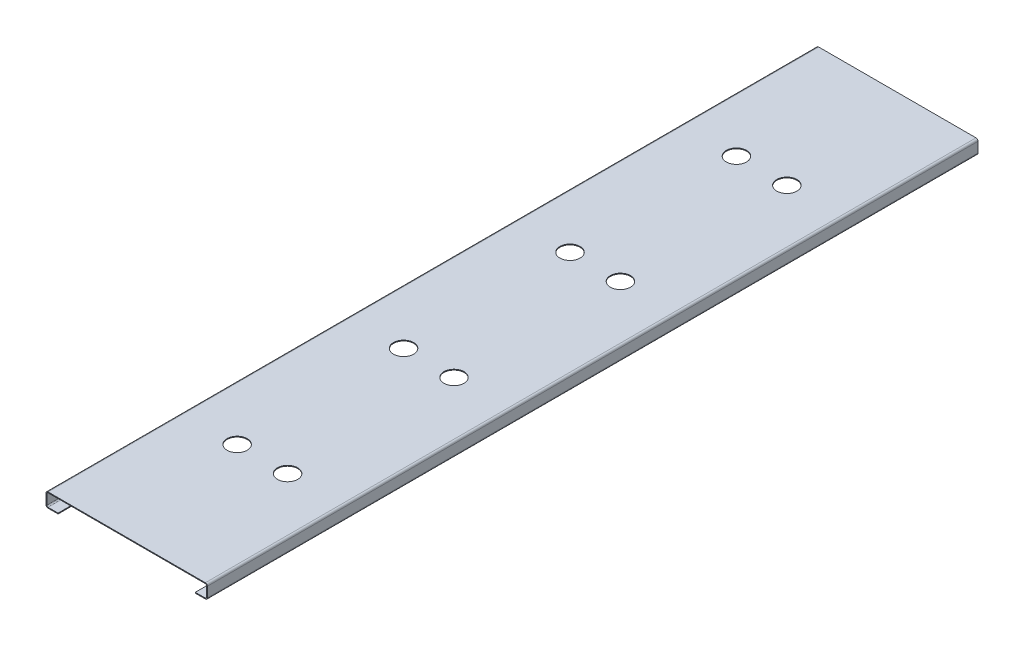
ISO-10303-21;
HEADER;
FILE_DESCRIPTION(('STEP AP214'),'2;1');
FILE_NAME('part.step','',(''),(''),'','','');
FILE_SCHEMA(('AUTOMOTIVE_DESIGN { 1 0 10303 214 1 1 1 1 }'));
ENDSEC;
DATA;
#1=APPLICATION_CONTEXT('core data for automotive mechanical design processes');
#2=APPLICATION_PROTOCOL_DEFINITION('international standard','automotive_design',2000,#1);
#3=PRODUCT_CONTEXT('',#1,'mechanical');
#4=PRODUCT('Part','Part','',(#3));
#5=PRODUCT_RELATED_PRODUCT_CATEGORY('part','',(#4));
#6=PRODUCT_DEFINITION_FORMATION('','',#4);
#7=PRODUCT_DEFINITION_CONTEXT('part definition',#1,'design');
#8=PRODUCT_DEFINITION('design','',#6,#7);
#9=PRODUCT_DEFINITION_SHAPE('','',#8);
#10=(LENGTH_UNIT() NAMED_UNIT(*) SI_UNIT(.MILLI.,.METRE.));
#11=(NAMED_UNIT(*) PLANE_ANGLE_UNIT() SI_UNIT($,.RADIAN.));
#12=(NAMED_UNIT(*) SI_UNIT($,.STERADIAN.) SOLID_ANGLE_UNIT());
#13=UNCERTAINTY_MEASURE_WITH_UNIT(LENGTH_MEASURE(1.E-05),#10,'distance_accuracy_value','');
#14=(GEOMETRIC_REPRESENTATION_CONTEXT(3) GLOBAL_UNCERTAINTY_ASSIGNED_CONTEXT((#13)) GLOBAL_UNIT_ASSIGNED_CONTEXT((#10,
#11,#12)) REPRESENTATION_CONTEXT('',''));
#15=CARTESIAN_POINT('',(0.,0.,0.));
#16=DIRECTION('',(0.,0.,1.));
#17=DIRECTION('',(1.,0.,0.));
#18=AXIS2_PLACEMENT_3D('',#15,#16,#17);
#19=CARTESIAN_POINT('',(0.,2.,764.));
#20=DIRECTION('',(0.,0.,1.));
#21=DIRECTION('',(1.,0.,0.));
#22=AXIS2_PLACEMENT_3D('',#19,#20,#21);
#23=PLANE('',#22);
#24=DIRECTION('',(1.,0.,0.));
#25=VECTOR('',#24,1.);
#26=CARTESIAN_POINT('',(0.,2.,764.));
#27=LINE('',#26,#25);
#28=CARTESIAN_POINT('',(0.,2.,764.));
#29=VERTEX_POINT('',#28);
#30=CARTESIAN_POINT('',(0.8,2.,764.));
#31=VERTEX_POINT('',#30);
#32=EDGE_CURVE('E11',#29,#31,#27,.T.);
#33=ORIENTED_EDGE('',*,*,#32,.F.);
#34=CARTESIAN_POINT('',(2.,2.,764.));
#35=DIRECTION('',(0.,0.,-1.));
#36=DIRECTION('',(1.,0.,0.));
#37=AXIS2_PLACEMENT_3D('',#34,#35,#36);
#38=CIRCLE('',#37,2.);
#39=CARTESIAN_POINT('',(2.,0.,764.));
#40=VERTEX_POINT('',#39);
#41=EDGE_CURVE('E409',#40,#29,#38,.T.);
#42=ORIENTED_EDGE('',*,*,#41,.F.);
#43=DIRECTION('',(0.,-1.,0.));
#44=VECTOR('',#43,1.);
#45=CARTESIAN_POINT('',(2.,0.799999999999998,764.));
#46=LINE('',#45,#44);
#47=CARTESIAN_POINT('',(2.,0.799999999999998,764.));
#48=VERTEX_POINT('',#47);
#49=EDGE_CURVE('E48',#48,#40,#46,.T.);
#50=ORIENTED_EDGE('',*,*,#49,.F.);
#51=CARTESIAN_POINT('',(2.,2.,764.));
#52=DIRECTION('',(0.,0.,1.));
#53=DIRECTION('',(1.,0.,0.));
#54=AXIS2_PLACEMENT_3D('',#51,#52,#53);
#55=CIRCLE('',#54,1.2);
#56=EDGE_CURVE('E421',#48,#31,#55,.F.);
#57=ORIENTED_EDGE('',*,*,#56,.T.);
#58=EDGE_LOOP('',(#33,#42,#50,#57));
#59=FACE_BOUND('',#58,.T.);
#60=ADVANCED_FACE('F39',(#59),#23,.T.);
#61=CARTESIAN_POINT('',(2.,0.799999999999998,764.));
#62=DIRECTION('',(0.,0.,1.));
#63=DIRECTION('',(1.,0.,0.));
#64=AXIS2_PLACEMENT_3D('',#61,#62,#63);
#65=PLANE('',#64);
#66=DIRECTION('',(0.,1.,0.));
#67=VECTOR('',#66,1.);
#68=CARTESIAN_POINT('',(0.,2.,764.));
#69=LINE('',#68,#67);
#70=CARTESIAN_POINT('',(0.,12.,764.));
#71=VERTEX_POINT('',#70);
#72=EDGE_CURVE('E406',#29,#71,#69,.T.);
#73=ORIENTED_EDGE('',*,*,#72,.F.);
#74=ORIENTED_EDGE('',*,*,#32,.T.);
#75=DIRECTION('',(0.,1.,0.));
#76=VECTOR('',#75,1.);
#77=CARTESIAN_POINT('',(0.8,2.,764.));
#78=LINE('',#77,#76);
#79=CARTESIAN_POINT('',(0.800000000000001,12.,764.));
#80=VERTEX_POINT('',#79);
#81=EDGE_CURVE('E424',#31,#80,#78,.T.);
#82=ORIENTED_EDGE('',*,*,#81,.T.);
#83=DIRECTION('',(-1.,0.,0.));
#84=VECTOR('',#83,1.);
#85=CARTESIAN_POINT('',(0.800000000000001,12.,764.));
#86=LINE('',#85,#84);
#87=EDGE_CURVE('E345',#80,#71,#86,.T.);
#88=ORIENTED_EDGE('',*,*,#87,.T.);
#89=EDGE_LOOP('',(#73,#74,#82,#88));
#90=FACE_BOUND('',#89,.T.);
#91=ADVANCED_FACE('F478',(#90),#65,.T.);
#92=CARTESIAN_POINT('',(2.,0.,0.));
#93=DIRECTION('',(0.,0.,-1.));
#94=DIRECTION('',(-1.,0.,0.));
#95=AXIS2_PLACEMENT_3D('',#92,#93,#94);
#96=PLANE('',#95);
#97=DIRECTION('',(0.,1.,0.));
#98=VECTOR('',#97,1.);
#99=CARTESIAN_POINT('',(2.,0.,0.));
#100=LINE('',#99,#98);
#101=CARTESIAN_POINT('',(2.,0.,0.));
#102=VERTEX_POINT('',#101);
#103=CARTESIAN_POINT('',(2.,0.799999999999998,0.));
#104=VERTEX_POINT('',#103);
#105=EDGE_CURVE('E351',#102,#104,#100,.T.);
#106=ORIENTED_EDGE('',*,*,#105,.F.);
#107=CARTESIAN_POINT('',(2.,2.,0.));
#108=DIRECTION('',(0.,0.,-1.));
#109=DIRECTION('',(1.,0.,0.));
#110=AXIS2_PLACEMENT_3D('',#107,#108,#109);
#111=CIRCLE('',#110,2.);
#112=CARTESIAN_POINT('',(0.,2.,0.));
#113=VERTEX_POINT('',#112);
#114=EDGE_CURVE('E255',#102,#113,#111,.T.);
#115=ORIENTED_EDGE('',*,*,#114,.T.);
#116=DIRECTION('',(-1.,0.,0.));
#117=VECTOR('',#116,1.);
#118=CARTESIAN_POINT('',(0.8,2.,0.));
#119=LINE('',#118,#117);
#120=CARTESIAN_POINT('',(0.8,2.,0.));
#121=VERTEX_POINT('',#120);
#122=EDGE_CURVE('E349',#121,#113,#119,.T.);
#123=ORIENTED_EDGE('',*,*,#122,.F.);
#124=CARTESIAN_POINT('',(2.,2.,0.));
#125=DIRECTION('',(0.,0.,1.));
#126=DIRECTION('',(1.,0.,0.));
#127=AXIS2_PLACEMENT_3D('',#124,#125,#126);
#128=CIRCLE('',#127,1.2);
#129=EDGE_CURVE('E267',#104,#121,#128,.F.);
#130=ORIENTED_EDGE('',*,*,#129,.F.);
#131=EDGE_LOOP('',(#106,#115,#123,#130));
#132=FACE_BOUND('',#131,.T.);
#133=ADVANCED_FACE('F483',(#132),#96,.T.);
#134=CARTESIAN_POINT('',(0.8,2.,0.));
#135=DIRECTION('',(0.,0.,-1.));
#136=DIRECTION('',(-1.,0.,0.));
#137=AXIS2_PLACEMENT_3D('',#134,#135,#136);
#138=PLANE('',#137);
#139=DIRECTION('',(-1.,0.,0.));
#140=VECTOR('',#139,1.);
#141=CARTESIAN_POINT('',(12.,0.,0.));
#142=LINE('',#141,#140);
#143=CARTESIAN_POINT('',(12.,0.,0.));
#144=VERTEX_POINT('',#143);
#145=EDGE_CURVE('E258',#144,#102,#142,.T.);
#146=ORIENTED_EDGE('',*,*,#145,.T.);
#147=ORIENTED_EDGE('',*,*,#105,.T.);
#148=DIRECTION('',(-1.,0.,0.));
#149=VECTOR('',#148,1.);
#150=CARTESIAN_POINT('',(12.,0.8,0.));
#151=LINE('',#150,#149);
#152=CARTESIAN_POINT('',(12.,0.8,0.));
#153=VERTEX_POINT('',#152);
#154=EDGE_CURVE('E264',#153,#104,#151,.T.);
#155=ORIENTED_EDGE('',*,*,#154,.F.);
#156=DIRECTION('',(0.,-1.,0.));
#157=VECTOR('',#156,1.);
#158=CARTESIAN_POINT('',(12.,0.8,0.));
#159=LINE('',#158,#157);
#160=EDGE_CURVE('E261',#153,#144,#159,.T.);
#161=ORIENTED_EDGE('',*,*,#160,.T.);
#162=EDGE_LOOP('',(#146,#147,#155,#161));
#163=FACE_BOUND('',#162,.T.);
#164=ADVANCED_FACE('F539',(#163),#138,.T.);
#165=CARTESIAN_POINT('',(2.,14.,764.));
#166=DIRECTION('',(0.,0.,1.));
#167=DIRECTION('',(1.,0.,0.));
#168=AXIS2_PLACEMENT_3D('',#165,#166,#167);
#169=PLANE('',#168);
#170=DIRECTION('',(0.,-1.,0.));
#171=VECTOR('',#170,1.);
#172=CARTESIAN_POINT('',(2.,14.,764.));
#173=LINE('',#172,#171);
#174=CARTESIAN_POINT('',(2.,14.,764.));
#175=VERTEX_POINT('',#174);
#176=CARTESIAN_POINT('',(2.,13.2,764.));
#177=VERTEX_POINT('',#176);
#178=EDGE_CURVE('E347',#175,#177,#173,.T.);
#179=ORIENTED_EDGE('',*,*,#178,.F.);
#180=CARTESIAN_POINT('',(2.,12.,764.));
#181=DIRECTION('',(0.,0.,-1.));
#182=DIRECTION('',(1.,0.,0.));
#183=AXIS2_PLACEMENT_3D('',#180,#181,#182);
#184=CIRCLE('',#183,2.);
#185=EDGE_CURVE('E403',#71,#175,#184,.T.);
#186=ORIENTED_EDGE('',*,*,#185,.F.);
#187=ORIENTED_EDGE('',*,*,#87,.F.);
#188=CARTESIAN_POINT('',(2.,12.,764.));
#189=DIRECTION('',(0.,0.,1.));
#190=DIRECTION('',(1.,0.,0.));
#191=AXIS2_PLACEMENT_3D('',#188,#189,#190);
#192=CIRCLE('',#191,1.2);
#193=EDGE_CURVE('E427',#80,#177,#192,.F.);
#194=ORIENTED_EDGE('',*,*,#193,.T.);
#195=EDGE_LOOP('',(#179,#186,#187,#194));
#196=FACE_BOUND('',#195,.T.);
#197=ADVANCED_FACE('F527',(#196),#169,.T.);
#198=CARTESIAN_POINT('',(0.800000000000001,12.,764.));
#199=DIRECTION('',(0.,0.,1.));
#200=DIRECTION('',(1.,0.,0.));
#201=AXIS2_PLACEMENT_3D('',#198,#199,#200);
#202=PLANE('',#201);
#203=DIRECTION('',(1.,0.,0.));
#204=VECTOR('',#203,1.);
#205=CARTESIAN_POINT('',(2.,14.,764.));
#206=LINE('',#205,#204);
#207=CARTESIAN_POINT('',(158.,14.,764.));
#208=VERTEX_POINT('',#207);
#209=EDGE_CURVE('E400',#175,#208,#206,.T.);
#210=ORIENTED_EDGE('',*,*,#209,.F.);
#211=ORIENTED_EDGE('',*,*,#178,.T.);
#212=DIRECTION('',(1.,0.,0.));
#213=VECTOR('',#212,1.);
#214=CARTESIAN_POINT('',(2.,13.2,764.));
#215=LINE('',#214,#213);
#216=CARTESIAN_POINT('',(158.,13.2,764.));
#217=VERTEX_POINT('',#216);
#218=EDGE_CURVE('E208',#177,#217,#215,.T.);
#219=ORIENTED_EDGE('',*,*,#218,.T.);
#220=DIRECTION('',(0.,1.,0.));
#221=VECTOR('',#220,1.);
#222=CARTESIAN_POINT('',(158.,13.2,764.));
#223=LINE('',#222,#221);
#224=EDGE_CURVE('E199',#217,#208,#223,.T.);
#225=ORIENTED_EDGE('',*,*,#224,.T.);
#226=EDGE_LOOP('',(#210,#211,#219,#225));
#227=FACE_BOUND('',#226,.T.);
#228=ADVANCED_FACE('F433',(#227),#202,.T.);
#229=CARTESIAN_POINT('',(0.,12.,0.));
#230=DIRECTION('',(0.,0.,-1.));
#231=DIRECTION('',(-1.,0.,0.));
#232=AXIS2_PLACEMENT_3D('',#229,#230,#231);
#233=PLANE('',#232);
#234=DIRECTION('',(1.,0.,0.));
#235=VECTOR('',#234,1.);
#236=CARTESIAN_POINT('',(0.,12.,0.));
#237=LINE('',#236,#235);
#238=CARTESIAN_POINT('',(0.,12.,0.));
#239=VERTEX_POINT('',#238);
#240=CARTESIAN_POINT('',(0.800000000000001,12.,0.));
#241=VERTEX_POINT('',#240);
#242=EDGE_CURVE('E343',#239,#241,#237,.T.);
#243=ORIENTED_EDGE('',*,*,#242,.F.);
#244=CARTESIAN_POINT('',(2.,12.,0.));
#245=DIRECTION('',(0.,0.,-1.));
#246=DIRECTION('',(1.,0.,0.));
#247=AXIS2_PLACEMENT_3D('',#244,#245,#246);
#248=CIRCLE('',#247,2.);
#249=CARTESIAN_POINT('',(2.,14.,0.));
#250=VERTEX_POINT('',#249);
#251=EDGE_CURVE('E249',#239,#250,#248,.T.);
#252=ORIENTED_EDGE('',*,*,#251,.T.);
#253=DIRECTION('',(0.,1.,0.));
#254=VECTOR('',#253,1.);
#255=CARTESIAN_POINT('',(2.,13.2,0.));
#256=LINE('',#255,#254);
#257=CARTESIAN_POINT('',(2.,13.2,0.));
#258=VERTEX_POINT('',#257);
#259=EDGE_CURVE('E198',#258,#250,#256,.T.);
#260=ORIENTED_EDGE('',*,*,#259,.F.);
#261=CARTESIAN_POINT('',(2.,12.,0.));
#262=DIRECTION('',(0.,0.,1.));
#263=DIRECTION('',(1.,0.,0.));
#264=AXIS2_PLACEMENT_3D('',#261,#262,#263);
#265=CIRCLE('',#264,1.2);
#266=EDGE_CURVE('E273',#241,#258,#265,.F.);
#267=ORIENTED_EDGE('',*,*,#266,.F.);
#268=EDGE_LOOP('',(#243,#252,#260,#267));
#269=FACE_BOUND('',#268,.T.);
#270=ADVANCED_FACE('F551',(#269),#233,.T.);
#271=CARTESIAN_POINT('',(2.,13.2,0.));
#272=DIRECTION('',(0.,0.,-1.));
#273=DIRECTION('',(-1.,0.,0.));
#274=AXIS2_PLACEMENT_3D('',#271,#272,#273);
#275=PLANE('',#274);
#276=DIRECTION('',(0.,1.,0.));
#277=VECTOR('',#276,1.);
#278=CARTESIAN_POINT('',(0.,2.,0.));
#279=LINE('',#278,#277);
#280=EDGE_CURVE('E252',#113,#239,#279,.T.);
#281=ORIENTED_EDGE('',*,*,#280,.T.);
#282=ORIENTED_EDGE('',*,*,#242,.T.);
#283=DIRECTION('',(0.,1.,0.));
#284=VECTOR('',#283,1.);
#285=CARTESIAN_POINT('',(0.8,2.,0.));
#286=LINE('',#285,#284);
#287=EDGE_CURVE('E270',#121,#241,#286,.T.);
#288=ORIENTED_EDGE('',*,*,#287,.F.);
#289=ORIENTED_EDGE('',*,*,#122,.T.);
#290=EDGE_LOOP('',(#281,#282,#288,#289));
#291=FACE_BOUND('',#290,.T.);
#292=ADVANCED_FACE('F536',(#291),#275,.T.);
#293=CARTESIAN_POINT('',(160.,12.,764.));
#294=DIRECTION('',(0.,0.,1.));
#295=DIRECTION('',(1.,0.,0.));
#296=AXIS2_PLACEMENT_3D('',#293,#294,#295);
#297=PLANE('',#296);
#298=DIRECTION('',(-1.,0.,0.));
#299=VECTOR('',#298,1.);
#300=CARTESIAN_POINT('',(160.,12.,764.));
#301=LINE('',#300,#299);
#302=CARTESIAN_POINT('',(160.,12.,764.));
#303=VERTEX_POINT('',#302);
#304=CARTESIAN_POINT('',(159.2,12.,764.));
#305=VERTEX_POINT('',#304);
#306=EDGE_CURVE('E186',#303,#305,#301,.T.);
#307=ORIENTED_EDGE('',*,*,#306,.F.);
#308=CARTESIAN_POINT('',(158.,12.,764.));
#309=DIRECTION('',(0.,0.,-1.));
#310=DIRECTION('',(1.,0.,0.));
#311=AXIS2_PLACEMENT_3D('',#308,#309,#310);
#312=CIRCLE('',#311,2.);
#313=EDGE_CURVE('E398',#208,#303,#312,.T.);
#314=ORIENTED_EDGE('',*,*,#313,.F.);
#315=ORIENTED_EDGE('',*,*,#224,.F.);
#316=CARTESIAN_POINT('',(158.,12.,764.));
#317=DIRECTION('',(0.,0.,1.));
#318=DIRECTION('',(1.,0.,0.));
#319=AXIS2_PLACEMENT_3D('',#316,#317,#318);
#320=CIRCLE('',#319,1.2);
#321=EDGE_CURVE('E202',#217,#305,#320,.F.);
#322=ORIENTED_EDGE('',*,*,#321,.T.);
#323=EDGE_LOOP('',(#307,#314,#315,#322));
#324=FACE_BOUND('',#323,.T.);
#325=ADVANCED_FACE('F204',(#324),#297,.T.);
#326=CARTESIAN_POINT('',(158.,13.2,764.));
#327=DIRECTION('',(0.,0.,1.));
#328=DIRECTION('',(1.,0.,0.));
#329=AXIS2_PLACEMENT_3D('',#326,#327,#328);
#330=PLANE('',#329);
#331=DIRECTION('',(0.,-1.,0.));
#332=VECTOR('',#331,1.);
#333=CARTESIAN_POINT('',(160.,12.,764.));
#334=LINE('',#333,#332);
#335=CARTESIAN_POINT('',(160.,2.,764.));
#336=VERTEX_POINT('',#335);
#337=EDGE_CURVE('E193',#303,#336,#334,.T.);
#338=ORIENTED_EDGE('',*,*,#337,.F.);
#339=ORIENTED_EDGE('',*,*,#306,.T.);
#340=DIRECTION('',(0.,1.,0.));
#341=VECTOR('',#340,1.);
#342=CARTESIAN_POINT('',(159.2,12.,764.));
#343=LINE('',#342,#341);
#344=CARTESIAN_POINT('',(159.2,2.,764.));
#345=VERTEX_POINT('',#344);
#346=EDGE_CURVE('E190',#305,#345,#343,.F.);
#347=ORIENTED_EDGE('',*,*,#346,.T.);
#348=DIRECTION('',(1.,0.,0.));
#349=VECTOR('',#348,1.);
#350=CARTESIAN_POINT('',(159.2,2.,764.));
#351=LINE('',#350,#349);
#352=EDGE_CURVE('E334',#345,#336,#351,.T.);
#353=ORIENTED_EDGE('',*,*,#352,.T.);
#354=EDGE_LOOP('',(#338,#339,#347,#353));
#355=FACE_BOUND('',#354,.T.);
#356=ADVANCED_FACE('F188',(#355),#330,.T.);
#357=CARTESIAN_POINT('',(158.,14.,0.));
#358=DIRECTION('',(0.,0.,-1.));
#359=DIRECTION('',(-1.,0.,0.));
#360=AXIS2_PLACEMENT_3D('',#357,#358,#359);
#361=PLANE('',#360);
#362=DIRECTION('',(0.,-1.,0.));
#363=VECTOR('',#362,1.);
#364=CARTESIAN_POINT('',(158.,14.,0.));
#365=LINE('',#364,#363);
#366=CARTESIAN_POINT('',(158.,14.,0.));
#367=VERTEX_POINT('',#366);
#368=CARTESIAN_POINT('',(158.,13.2,0.));
#369=VERTEX_POINT('',#368);
#370=EDGE_CURVE('E339',#367,#369,#365,.T.);
#371=ORIENTED_EDGE('',*,*,#370,.F.);
#372=CARTESIAN_POINT('',(158.,12.,0.));
#373=DIRECTION('',(0.,0.,-1.));
#374=DIRECTION('',(1.,0.,0.));
#375=AXIS2_PLACEMENT_3D('',#372,#373,#374);
#376=CIRCLE('',#375,2.);
#377=CARTESIAN_POINT('',(160.,12.,0.));
#378=VERTEX_POINT('',#377);
#379=EDGE_CURVE('E243',#367,#378,#376,.T.);
#380=ORIENTED_EDGE('',*,*,#379,.T.);
#381=DIRECTION('',(1.,0.,0.));
#382=VECTOR('',#381,1.);
#383=CARTESIAN_POINT('',(159.2,12.,0.));
#384=LINE('',#383,#382);
#385=CARTESIAN_POINT('',(159.2,12.,0.));
#386=VERTEX_POINT('',#385);
#387=EDGE_CURVE('E337',#386,#378,#384,.T.);
#388=ORIENTED_EDGE('',*,*,#387,.F.);
#389=CARTESIAN_POINT('',(158.,12.,0.));
#390=DIRECTION('',(0.,0.,1.));
#391=DIRECTION('',(1.,0.,0.));
#392=AXIS2_PLACEMENT_3D('',#389,#390,#391);
#393=CIRCLE('',#392,1.2);
#394=EDGE_CURVE('E215',#369,#386,#393,.F.);
#395=ORIENTED_EDGE('',*,*,#394,.F.);
#396=EDGE_LOOP('',(#371,#380,#388,#395));
#397=FACE_BOUND('',#396,.T.);
#398=ADVANCED_FACE('F439',(#397),#361,.T.);
#399=CARTESIAN_POINT('',(159.2,12.,0.));
#400=DIRECTION('',(0.,0.,-1.));
#401=DIRECTION('',(-1.,0.,0.));
#402=AXIS2_PLACEMENT_3D('',#399,#400,#401);
#403=PLANE('',#402);
#404=DIRECTION('',(1.,0.,0.));
#405=VECTOR('',#404,1.);
#406=CARTESIAN_POINT('',(2.,14.,0.));
#407=LINE('',#406,#405);
#408=EDGE_CURVE('E246',#250,#367,#407,.T.);
#409=ORIENTED_EDGE('',*,*,#408,.T.);
#410=ORIENTED_EDGE('',*,*,#370,.T.);
#411=DIRECTION('',(1.,0.,0.));
#412=VECTOR('',#411,1.);
#413=CARTESIAN_POINT('',(2.,13.2,0.));
#414=LINE('',#413,#412);
#415=EDGE_CURVE('E276',#258,#369,#414,.T.);
#416=ORIENTED_EDGE('',*,*,#415,.F.);
#417=ORIENTED_EDGE('',*,*,#259,.T.);
#418=EDGE_LOOP('',(#409,#410,#416,#417));
#419=FACE_BOUND('',#418,.T.);
#420=ADVANCED_FACE('F562',(#419),#403,.T.);
#421=CARTESIAN_POINT('',(158.,0.,764.));
#422=DIRECTION('',(0.,0.,1.));
#423=DIRECTION('',(1.,0.,0.));
#424=AXIS2_PLACEMENT_3D('',#421,#422,#423);
#425=PLANE('',#424);
#426=DIRECTION('',(0.,1.,0.));
#427=VECTOR('',#426,1.);
#428=CARTESIAN_POINT('',(158.,0.,764.));
#429=LINE('',#428,#427);
#430=CARTESIAN_POINT('',(158.,0.,764.));
#431=VERTEX_POINT('',#430);
#432=CARTESIAN_POINT('',(158.,0.8,764.));
#433=VERTEX_POINT('',#432);
#434=EDGE_CURVE('E57',#431,#433,#429,.T.);
#435=ORIENTED_EDGE('',*,*,#434,.F.);
#436=CARTESIAN_POINT('',(158.,2.,764.));
#437=DIRECTION('',(0.,0.,-1.));
#438=DIRECTION('',(-1.,0.,0.));
#439=AXIS2_PLACEMENT_3D('',#436,#437,#438);
#440=CIRCLE('',#439,2.);
#441=EDGE_CURVE('E394',#336,#431,#440,.T.);
#442=ORIENTED_EDGE('',*,*,#441,.F.);
#443=ORIENTED_EDGE('',*,*,#352,.F.);
#444=CARTESIAN_POINT('',(158.,2.,764.));
#445=DIRECTION('',(0.,0.,1.));
#446=DIRECTION('',(1.,0.,0.));
#447=AXIS2_PLACEMENT_3D('',#444,#445,#446);
#448=CIRCLE('',#447,1.2);
#449=EDGE_CURVE('E223',#345,#433,#448,.F.);
#450=ORIENTED_EDGE('',*,*,#449,.T.);
#451=EDGE_LOOP('',(#435,#442,#443,#450));
#452=FACE_BOUND('',#451,.T.);
#453=ADVANCED_FACE('F565',(#452),#425,.T.);
#454=CARTESIAN_POINT('',(159.2,2.,764.));
#455=DIRECTION('',(0.,0.,1.));
#456=DIRECTION('',(1.,0.,0.));
#457=AXIS2_PLACEMENT_3D('',#454,#455,#456);
#458=PLANE('',#457);
#459=DIRECTION('',(-1.,0.,0.));
#460=VECTOR('',#459,1.);
#461=CARTESIAN_POINT('',(158.,0.,764.));
#462=LINE('',#461,#460);
#463=CARTESIAN_POINT('',(148.,0.,764.));
#464=VERTEX_POINT('',#463);
#465=EDGE_CURVE('E391',#431,#464,#462,.T.);
#466=ORIENTED_EDGE('',*,*,#465,.F.);
#467=ORIENTED_EDGE('',*,*,#434,.T.);
#468=DIRECTION('',(-1.,0.,0.));
#469=VECTOR('',#468,1.);
#470=CARTESIAN_POINT('',(158.,0.8,764.));
#471=LINE('',#470,#469);
#472=CARTESIAN_POINT('',(148.,0.799999999999999,764.));
#473=VERTEX_POINT('',#472);
#474=EDGE_CURVE('E135',#433,#473,#471,.T.);
#475=ORIENTED_EDGE('',*,*,#474,.T.);
#476=DIRECTION('',(0.,1.,0.));
#477=VECTOR('',#476,1.);
#478=CARTESIAN_POINT('',(148.,0.,764.));
#479=LINE('',#478,#477);
#480=EDGE_CURVE('E388',#464,#473,#479,.T.);
#481=ORIENTED_EDGE('',*,*,#480,.F.);
#482=EDGE_LOOP('',(#466,#467,#475,#481));
#483=FACE_BOUND('',#482,.T.);
#484=ADVANCED_FACE('F466',(#483),#458,.T.);
#485=CARTESIAN_POINT('',(160.,2.,0.));
#486=DIRECTION('',(0.,0.,-1.));
#487=DIRECTION('',(-1.,0.,0.));
#488=AXIS2_PLACEMENT_3D('',#485,#486,#487);
#489=PLANE('',#488);
#490=DIRECTION('',(-1.,0.,0.));
#491=VECTOR('',#490,1.);
#492=CARTESIAN_POINT('',(160.,2.,0.));
#493=LINE('',#492,#491);
#494=CARTESIAN_POINT('',(160.,2.,0.));
#495=VERTEX_POINT('',#494);
#496=CARTESIAN_POINT('',(159.2,2.,0.));
#497=VERTEX_POINT('',#496);
#498=EDGE_CURVE('E122',#495,#497,#493,.T.);
#499=ORIENTED_EDGE('',*,*,#498,.F.);
#500=CARTESIAN_POINT('',(158.,2.,0.));
#501=DIRECTION('',(0.,0.,-1.));
#502=DIRECTION('',(-1.,0.,0.));
#503=AXIS2_PLACEMENT_3D('',#500,#501,#502);
#504=CIRCLE('',#503,2.);
#505=CARTESIAN_POINT('',(158.,0.,0.));
#506=VERTEX_POINT('',#505);
#507=EDGE_CURVE('E239',#495,#506,#504,.T.);
#508=ORIENTED_EDGE('',*,*,#507,.T.);
#509=DIRECTION('',(0.,-1.,0.));
#510=VECTOR('',#509,1.);
#511=CARTESIAN_POINT('',(158.,0.8,0.));
#512=LINE('',#511,#510);
#513=CARTESIAN_POINT('',(158.,0.8,0.));
#514=VERTEX_POINT('',#513);
#515=EDGE_CURVE('E129',#514,#506,#512,.T.);
#516=ORIENTED_EDGE('',*,*,#515,.F.);
#517=CARTESIAN_POINT('',(158.,2.,0.));
#518=DIRECTION('',(0.,0.,1.));
#519=DIRECTION('',(1.,0.,0.));
#520=AXIS2_PLACEMENT_3D('',#517,#518,#519);
#521=CIRCLE('',#520,1.2);
#522=EDGE_CURVE('E282',#497,#514,#521,.F.);
#523=ORIENTED_EDGE('',*,*,#522,.F.);
#524=EDGE_LOOP('',(#499,#508,#516,#523));
#525=FACE_BOUND('',#524,.T.);
#526=ADVANCED_FACE('F454',(#525),#489,.T.);
#527=CARTESIAN_POINT('',(158.,0.8,0.));
#528=DIRECTION('',(0.,0.,-1.));
#529=DIRECTION('',(-1.,0.,0.));
#530=AXIS2_PLACEMENT_3D('',#527,#528,#529);
#531=PLANE('',#530);
#532=DIRECTION('',(0.,-1.,0.));
#533=VECTOR('',#532,1.);
#534=CARTESIAN_POINT('',(160.,12.,0.));
#535=LINE('',#534,#533);
#536=EDGE_CURVE('E241',#378,#495,#535,.T.);
#537=ORIENTED_EDGE('',*,*,#536,.T.);
#538=ORIENTED_EDGE('',*,*,#498,.T.);
#539=DIRECTION('',(0.,1.,0.));
#540=VECTOR('',#539,1.);
#541=CARTESIAN_POINT('',(159.2,12.,0.));
#542=LINE('',#541,#540);
#543=EDGE_CURVE('E280',#386,#497,#542,.F.);
#544=ORIENTED_EDGE('',*,*,#543,.F.);
#545=ORIENTED_EDGE('',*,*,#387,.T.);
#546=EDGE_LOOP('',(#537,#538,#544,#545));
#547=FACE_BOUND('',#546,.T.);
#548=ADVANCED_FACE('F441',(#547),#531,.T.);
#549=CARTESIAN_POINT('',(158.,0.8,764.));
#550=DIRECTION('',(0.,-1.,0.));
#551=DIRECTION('',(1.,0.,0.));
#552=AXIS2_PLACEMENT_3D('',#549,#550,#551);
#553=PLANE('',#552);
#554=DIRECTION('',(-1.,0.,0.));
#555=VECTOR('',#554,1.);
#556=CARTESIAN_POINT('',(158.,0.8,0.));
#557=LINE('',#556,#555);
#558=CARTESIAN_POINT('',(148.,0.799999999999999,0.));
#559=VERTEX_POINT('',#558);
#560=EDGE_CURVE('E229',#514,#559,#557,.T.);
#561=ORIENTED_EDGE('',*,*,#560,.T.);
#562=DIRECTION('',(0.,0.,-1.));
#563=VECTOR('',#562,1.);
#564=CARTESIAN_POINT('',(148.,0.799999999999999,764.));
#565=LINE('',#564,#563);
#566=EDGE_CURVE('E330',#473,#559,#565,.T.);
#567=ORIENTED_EDGE('',*,*,#566,.F.);
#568=ORIENTED_EDGE('',*,*,#474,.F.);
#569=DIRECTION('',(0.,0.,-1.));
#570=VECTOR('',#569,1.);
#571=CARTESIAN_POINT('',(158.,0.8,764.));
#572=LINE('',#571,#570);
#573=EDGE_CURVE('E225',#433,#514,#572,.T.);
#574=ORIENTED_EDGE('',*,*,#573,.T.);
#575=EDGE_LOOP('',(#561,#567,#568,#574));
#576=FACE_BOUND('',#575,.T.);
#577=ADVANCED_FACE('F460',(#576),#553,.F.);
#578=CARTESIAN_POINT('',(148.,0.,764.));
#579=DIRECTION('',(-1.,0.,0.));
#580=DIRECTION('',(0.,0.,1.));
#581=AXIS2_PLACEMENT_3D('',#578,#579,#580);
#582=PLANE('',#581);
#583=DIRECTION('',(0.,1.,0.));
#584=VECTOR('',#583,1.);
#585=CARTESIAN_POINT('',(148.,0.,0.));
#586=LINE('',#585,#584);
#587=CARTESIAN_POINT('',(148.,0.,0.));
#588=VERTEX_POINT('',#587);
#589=EDGE_CURVE('E232',#588,#559,#586,.T.);
#590=ORIENTED_EDGE('',*,*,#589,.F.);
#591=DIRECTION('',(0.,0.,-1.));
#592=VECTOR('',#591,1.);
#593=CARTESIAN_POINT('',(148.,0.,764.));
#594=LINE('',#593,#592);
#595=EDGE_CURVE('E328',#464,#588,#594,.T.);
#596=ORIENTED_EDGE('',*,*,#595,.F.);
#597=ORIENTED_EDGE('',*,*,#480,.T.);
#598=ORIENTED_EDGE('',*,*,#566,.T.);
#599=EDGE_LOOP('',(#590,#596,#597,#598));
#600=FACE_BOUND('',#599,.T.);
#601=ADVANCED_FACE('F465',(#600),#582,.T.);
#602=CARTESIAN_POINT('',(158.,0.,764.));
#603=DIRECTION('',(0.,-1.,0.));
#604=DIRECTION('',(1.,0.,0.));
#605=AXIS2_PLACEMENT_3D('',#602,#603,#604);
#606=PLANE('',#605);
#607=DIRECTION('',(-1.,0.,0.));
#608=VECTOR('',#607,1.);
#609=CARTESIAN_POINT('',(158.,0.,0.));
#610=LINE('',#609,#608);
#611=EDGE_CURVE('E236',#506,#588,#610,.T.);
#612=ORIENTED_EDGE('',*,*,#611,.F.);
#613=DIRECTION('',(0.,0.,-1.));
#614=VECTOR('',#613,1.);
#615=CARTESIAN_POINT('',(158.,0.,764.));
#616=LINE('',#615,#614);
#617=EDGE_CURVE('E325',#431,#506,#616,.T.);
#618=ORIENTED_EDGE('',*,*,#617,.F.);
#619=ORIENTED_EDGE('',*,*,#465,.T.);
#620=ORIENTED_EDGE('',*,*,#595,.T.);
#621=EDGE_LOOP('',(#612,#618,#619,#620));
#622=FACE_BOUND('',#621,.T.);
#623=ADVANCED_FACE('F468',(#622),#606,.T.);
#624=CARTESIAN_POINT('',(158.,2.,764.));
#625=DIRECTION('',(0.,0.,-1.));
#626=DIRECTION('',(-1.,0.,0.));
#627=AXIS2_PLACEMENT_3D('',#624,#625,#626);
#628=CYLINDRICAL_SURFACE('',#627,2.);
#629=ORIENTED_EDGE('',*,*,#507,.F.);
#630=DIRECTION('',(0.,0.,-1.));
#631=VECTOR('',#630,1.);
#632=CARTESIAN_POINT('',(160.,2.,764.));
#633=LINE('',#632,#631);
#634=EDGE_CURVE('E322',#336,#495,#633,.T.);
#635=ORIENTED_EDGE('',*,*,#634,.F.);
#636=ORIENTED_EDGE('',*,*,#441,.T.);
#637=ORIENTED_EDGE('',*,*,#617,.T.);
#638=EDGE_LOOP('',(#629,#635,#636,#637));
#639=FACE_BOUND('',#638,.T.);
#640=ADVANCED_FACE('F451',(#639),#628,.T.);
#641=CARTESIAN_POINT('',(160.,12.,764.));
#642=DIRECTION('',(1.,0.,0.));
#643=DIRECTION('',(0.,0.,-1.));
#644=AXIS2_PLACEMENT_3D('',#641,#642,#643);
#645=PLANE('',#644);
#646=ORIENTED_EDGE('',*,*,#536,.F.);
#647=DIRECTION('',(0.,0.,-1.));
#648=VECTOR('',#647,1.);
#649=CARTESIAN_POINT('',(160.,12.,764.));
#650=LINE('',#649,#648);
#651=EDGE_CURVE('E319',#303,#378,#650,.T.);
#652=ORIENTED_EDGE('',*,*,#651,.F.);
#653=ORIENTED_EDGE('',*,*,#337,.T.);
#654=ORIENTED_EDGE('',*,*,#634,.T.);
#655=EDGE_LOOP('',(#646,#652,#653,#654));
#656=FACE_BOUND('',#655,.T.);
#657=ADVANCED_FACE('F446',(#656),#645,.T.);
#658=CARTESIAN_POINT('',(158.,12.,764.));
#659=DIRECTION('',(0.,0.,-1.));
#660=DIRECTION('',(-1.,0.,0.));
#661=AXIS2_PLACEMENT_3D('',#658,#659,#660);
#662=CYLINDRICAL_SURFACE('',#661,2.);
#663=ORIENTED_EDGE('',*,*,#379,.F.);
#664=DIRECTION('',(0.,0.,-1.));
#665=VECTOR('',#664,1.);
#666=CARTESIAN_POINT('',(158.,14.,764.));
#667=LINE('',#666,#665);
#668=EDGE_CURVE('E316',#208,#367,#667,.T.);
#669=ORIENTED_EDGE('',*,*,#668,.F.);
#670=ORIENTED_EDGE('',*,*,#313,.T.);
#671=ORIENTED_EDGE('',*,*,#651,.T.);
#672=EDGE_LOOP('',(#663,#669,#670,#671));
#673=FACE_BOUND('',#672,.T.);
#674=ADVANCED_FACE('F444',(#673),#662,.T.);
#675=CARTESIAN_POINT('',(2.,14.,764.));
#676=DIRECTION('',(0.,1.,0.));
#677=DIRECTION('',(0.,0.,1.));
#678=AXIS2_PLACEMENT_3D('',#675,#676,#677);
#679=PLANE('',#678);
#680=CARTESIAN_POINT('',(105.,14.,299.5));
#681=DIRECTION('',(0.,1.,0.));
#682=DIRECTION('',(0.,0.,1.));
#683=AXIS2_PLACEMENT_3D('',#680,#681,#682);
#684=CIRCLE('',#683,10.);
#685=CARTESIAN_POINT('',(105.,14.,309.5));
#686=VERTEX_POINT('',#685);
#687=EDGE_CURVE('E361',#686,#686,#684,.T.);
#688=ORIENTED_EDGE('',*,*,#687,.F.);
#689=EDGE_LOOP('',(#688));
#690=FACE_BOUND('',#689,.T.);
#691=CARTESIAN_POINT('',(105.,14.,464.5));
#692=DIRECTION('',(0.,1.,0.));
#693=DIRECTION('',(0.,0.,1.));
#694=AXIS2_PLACEMENT_3D('',#691,#692,#693);
#695=CIRCLE('',#694,10.);
#696=CARTESIAN_POINT('',(105.,14.,474.5));
#697=VERTEX_POINT('',#696);
#698=EDGE_CURVE('E1011',#697,#697,#695,.T.);
#699=ORIENTED_EDGE('',*,*,#698,.F.);
#700=EDGE_LOOP('',(#699));
#701=FACE_BOUND('',#700,.T.);
#702=CARTESIAN_POINT('',(105.,14.,629.5));
#703=DIRECTION('',(0.,1.,0.));
#704=DIRECTION('',(0.,0.,1.));
#705=AXIS2_PLACEMENT_3D('',#702,#703,#704);
#706=CIRCLE('',#705,10.);
#707=CARTESIAN_POINT('',(105.,14.,639.5));
#708=VERTEX_POINT('',#707);
#709=EDGE_CURVE('E1014',#708,#708,#706,.T.);
#710=ORIENTED_EDGE('',*,*,#709,.F.);
#711=EDGE_LOOP('',(#710));
#712=FACE_BOUND('',#711,.T.);
#713=CARTESIAN_POINT('',(54.9999999999999,14.,629.5));
#714=DIRECTION('',(0.,1.,0.));
#715=DIRECTION('',(0.,0.,1.));
#716=AXIS2_PLACEMENT_3D('',#713,#714,#715);
#717=CIRCLE('',#716,10.);
#718=CARTESIAN_POINT('',(54.9999999999999,14.,639.5));
#719=VERTEX_POINT('',#718);
#720=EDGE_CURVE('E1019',#719,#719,#717,.T.);
#721=ORIENTED_EDGE('',*,*,#720,.F.);
#722=EDGE_LOOP('',(#721));
#723=FACE_BOUND('',#722,.T.);
#724=CARTESIAN_POINT('',(54.9999999999999,14.,464.5));
#725=DIRECTION('',(0.,1.,0.));
#726=DIRECTION('',(0.,0.,1.));
#727=AXIS2_PLACEMENT_3D('',#724,#725,#726);
#728=CIRCLE('',#727,10.);
#729=CARTESIAN_POINT('',(54.9999999999999,14.,474.5));
#730=VERTEX_POINT('',#729);
#731=EDGE_CURVE('E1022',#730,#730,#728,.T.);
#732=ORIENTED_EDGE('',*,*,#731,.F.);
#733=EDGE_LOOP('',(#732));
#734=FACE_BOUND('',#733,.T.);
#735=CARTESIAN_POINT('',(54.9999999999999,14.,299.5));
#736=DIRECTION('',(0.,1.,0.));
#737=DIRECTION('',(0.,0.,1.));
#738=AXIS2_PLACEMENT_3D('',#735,#736,#737);
#739=CIRCLE('',#738,10.);
#740=CARTESIAN_POINT('',(54.9999999999999,14.,309.5));
#741=VERTEX_POINT('',#740);
#742=EDGE_CURVE('E1024',#741,#741,#739,.T.);
#743=ORIENTED_EDGE('',*,*,#742,.F.);
#744=EDGE_LOOP('',(#743));
#745=FACE_BOUND('',#744,.T.);
#746=CARTESIAN_POINT('',(54.9999999999999,14.,134.5));
#747=DIRECTION('',(0.,1.,0.));
#748=DIRECTION('',(0.,0.,1.));
#749=AXIS2_PLACEMENT_3D('',#746,#747,#748);
#750=CIRCLE('',#749,10.);
#751=CARTESIAN_POINT('',(54.9999999999999,14.,144.5));
#752=VERTEX_POINT('',#751);
#753=EDGE_CURVE('E385',#752,#752,#750,.T.);
#754=ORIENTED_EDGE('',*,*,#753,.F.);
#755=EDGE_LOOP('',(#754));
#756=FACE_BOUND('',#755,.T.);
#757=CARTESIAN_POINT('',(105.,14.,134.5));
#758=DIRECTION('',(0.,1.,0.));
#759=DIRECTION('',(0.,0.,1.));
#760=AXIS2_PLACEMENT_3D('',#757,#758,#759);
#761=CIRCLE('',#760,10.);
#762=CARTESIAN_POINT('',(105.,14.,144.5));
#763=VERTEX_POINT('',#762);
#764=EDGE_CURVE('E356',#763,#763,#761,.T.);
#765=ORIENTED_EDGE('',*,*,#764,.F.);
#766=EDGE_LOOP('',(#765));
#767=FACE_BOUND('',#766,.T.);
#768=ORIENTED_EDGE('',*,*,#408,.F.);
#769=DIRECTION('',(0.,0.,-1.));
#770=VECTOR('',#769,1.);
#771=CARTESIAN_POINT('',(2.,14.,764.));
#772=LINE('',#771,#770);
#773=EDGE_CURVE('E313',#175,#250,#772,.T.);
#774=ORIENTED_EDGE('',*,*,#773,.F.);
#775=ORIENTED_EDGE('',*,*,#209,.T.);
#776=ORIENTED_EDGE('',*,*,#668,.T.);
#777=EDGE_LOOP('',(#768,#774,#775,#776));
#778=FACE_BOUND('',#777,.T.);
#779=ADVANCED_FACE('F616',(#690,#701,#712,#723,#734,#745,#756,#767,#778),#679,.T.);
#780=CARTESIAN_POINT('',(2.,12.,764.));
#781=DIRECTION('',(0.,0.,-1.));
#782=DIRECTION('',(-1.,0.,0.));
#783=AXIS2_PLACEMENT_3D('',#780,#781,#782);
#784=CYLINDRICAL_SURFACE('',#783,2.);
#785=ORIENTED_EDGE('',*,*,#251,.F.);
#786=DIRECTION('',(0.,0.,-1.));
#787=VECTOR('',#786,1.);
#788=CARTESIAN_POINT('',(0.,12.,764.));
#789=LINE('',#788,#787);
#790=EDGE_CURVE('E310',#71,#239,#789,.T.);
#791=ORIENTED_EDGE('',*,*,#790,.F.);
#792=ORIENTED_EDGE('',*,*,#185,.T.);
#793=ORIENTED_EDGE('',*,*,#773,.T.);
#794=EDGE_LOOP('',(#785,#791,#792,#793));
#795=FACE_BOUND('',#794,.T.);
#796=ADVANCED_FACE('F532',(#795),#784,.T.);
#797=CARTESIAN_POINT('',(0.,2.,764.));
#798=DIRECTION('',(-1.,0.,0.));
#799=DIRECTION('',(0.,-1.,0.));
#800=AXIS2_PLACEMENT_3D('',#797,#798,#799);
#801=PLANE('',#800);
#802=ORIENTED_EDGE('',*,*,#280,.F.);
#803=DIRECTION('',(0.,0.,-1.));
#804=VECTOR('',#803,1.);
#805=CARTESIAN_POINT('',(0.,2.,764.));
#806=LINE('',#805,#804);
#807=EDGE_CURVE('E307',#29,#113,#806,.T.);
#808=ORIENTED_EDGE('',*,*,#807,.F.);
#809=ORIENTED_EDGE('',*,*,#72,.T.);
#810=ORIENTED_EDGE('',*,*,#790,.T.);
#811=EDGE_LOOP('',(#802,#808,#809,#810));
#812=FACE_BOUND('',#811,.T.);
#813=ADVANCED_FACE('F492',(#812),#801,.T.);
#814=CARTESIAN_POINT('',(2.,2.,764.));
#815=DIRECTION('',(0.,0.,-1.));
#816=DIRECTION('',(-1.,0.,0.));
#817=AXIS2_PLACEMENT_3D('',#814,#815,#816);
#818=CYLINDRICAL_SURFACE('',#817,2.);
#819=ORIENTED_EDGE('',*,*,#114,.F.);
#820=DIRECTION('',(0.,0.,-1.));
#821=VECTOR('',#820,1.);
#822=CARTESIAN_POINT('',(2.,0.,764.));
#823=LINE('',#822,#821);
#824=EDGE_CURVE('E304',#40,#102,#823,.T.);
#825=ORIENTED_EDGE('',*,*,#824,.F.);
#826=ORIENTED_EDGE('',*,*,#41,.T.);
#827=ORIENTED_EDGE('',*,*,#807,.T.);
#828=EDGE_LOOP('',(#819,#825,#826,#827));
#829=FACE_BOUND('',#828,.T.);
#830=ADVANCED_FACE('F497',(#829),#818,.T.);
#831=CARTESIAN_POINT('',(12.,0.,764.));
#832=DIRECTION('',(0.,-1.,0.));
#833=DIRECTION('',(1.,0.,0.));
#834=AXIS2_PLACEMENT_3D('',#831,#832,#833);
#835=PLANE('',#834);
#836=ORIENTED_EDGE('',*,*,#145,.F.);
#837=DIRECTION('',(0.,0.,-1.));
#838=VECTOR('',#837,1.);
#839=CARTESIAN_POINT('',(12.,0.,764.));
#840=LINE('',#839,#838);
#841=CARTESIAN_POINT('',(12.,0.,764.));
#842=VERTEX_POINT('',#841);
#843=EDGE_CURVE('E302',#842,#144,#840,.T.);
#844=ORIENTED_EDGE('',*,*,#843,.F.);
#845=DIRECTION('',(-1.,0.,0.));
#846=VECTOR('',#845,1.);
#847=CARTESIAN_POINT('',(12.,0.,764.));
#848=LINE('',#847,#846);
#849=EDGE_CURVE('E412',#842,#40,#848,.T.);
#850=ORIENTED_EDGE('',*,*,#849,.T.);
#851=ORIENTED_EDGE('',*,*,#824,.T.);
#852=EDGE_LOOP('',(#836,#844,#850,#851));
#853=FACE_BOUND('',#852,.T.);
#854=ADVANCED_FACE('F500',(#853),#835,.T.);
#855=CARTESIAN_POINT('',(12.,0.8,764.));
#856=DIRECTION('',(1.,0.,0.));
#857=DIRECTION('',(0.,0.,-1.));
#858=AXIS2_PLACEMENT_3D('',#855,#856,#857);
#859=PLANE('',#858);
#860=ORIENTED_EDGE('',*,*,#160,.F.);
#861=DIRECTION('',(0.,0.,-1.));
#862=VECTOR('',#861,1.);
#863=CARTESIAN_POINT('',(12.,0.8,764.));
#864=LINE('',#863,#862);
#865=CARTESIAN_POINT('',(12.,0.8,764.));
#866=VERTEX_POINT('',#865);
#867=EDGE_CURVE('E300',#866,#153,#864,.T.);
#868=ORIENTED_EDGE('',*,*,#867,.F.);
#869=DIRECTION('',(0.,-1.,0.));
#870=VECTOR('',#869,1.);
#871=CARTESIAN_POINT('',(12.,0.8,764.));
#872=LINE('',#871,#870);
#873=EDGE_CURVE('E415',#866,#842,#872,.T.);
#874=ORIENTED_EDGE('',*,*,#873,.T.);
#875=ORIENTED_EDGE('',*,*,#843,.T.);
#876=EDGE_LOOP('',(#860,#868,#874,#875));
#877=FACE_BOUND('',#876,.T.);
#878=ADVANCED_FACE('F507',(#877),#859,.T.);
#879=CARTESIAN_POINT('',(12.,0.8,764.));
#880=DIRECTION('',(0.,-1.,0.));
#881=DIRECTION('',(1.,0.,0.));
#882=AXIS2_PLACEMENT_3D('',#879,#880,#881);
#883=PLANE('',#882);
#884=ORIENTED_EDGE('',*,*,#154,.T.);
#885=DIRECTION('',(0.,0.,-1.));
#886=VECTOR('',#885,1.);
#887=CARTESIAN_POINT('',(2.,0.799999999999998,764.));
#888=LINE('',#887,#886);
#889=EDGE_CURVE('E297',#48,#104,#888,.T.);
#890=ORIENTED_EDGE('',*,*,#889,.F.);
#891=DIRECTION('',(-1.,0.,0.));
#892=VECTOR('',#891,1.);
#893=CARTESIAN_POINT('',(12.,0.8,764.));
#894=LINE('',#893,#892);
#895=EDGE_CURVE('E418',#866,#48,#894,.T.);
#896=ORIENTED_EDGE('',*,*,#895,.F.);
#897=ORIENTED_EDGE('',*,*,#867,.T.);
#898=EDGE_LOOP('',(#884,#890,#896,#897));
#899=FACE_BOUND('',#898,.T.);
#900=ADVANCED_FACE('F512',(#899),#883,.F.);
#901=CARTESIAN_POINT('',(2.,2.,764.));
#902=DIRECTION('',(0.,0.,-1.));
#903=DIRECTION('',(-1.,0.,0.));
#904=AXIS2_PLACEMENT_3D('',#901,#902,#903);
#905=CYLINDRICAL_SURFACE('',#904,1.2);
#906=ORIENTED_EDGE('',*,*,#129,.T.);
#907=DIRECTION('',(0.,0.,-1.));
#908=VECTOR('',#907,1.);
#909=CARTESIAN_POINT('',(0.8,2.,764.));
#910=LINE('',#909,#908);
#911=EDGE_CURVE('E294',#31,#121,#910,.T.);
#912=ORIENTED_EDGE('',*,*,#911,.F.);
#913=ORIENTED_EDGE('',*,*,#56,.F.);
#914=ORIENTED_EDGE('',*,*,#889,.T.);
#915=EDGE_LOOP('',(#906,#912,#913,#914));
#916=FACE_BOUND('',#915,.T.);
#917=ADVANCED_FACE('F515',(#916),#905,.F.);
#918=CARTESIAN_POINT('',(0.8,2.,764.));
#919=DIRECTION('',(-1.,0.,0.));
#920=DIRECTION('',(0.,-1.,0.));
#921=AXIS2_PLACEMENT_3D('',#918,#919,#920);
#922=PLANE('',#921);
#923=ORIENTED_EDGE('',*,*,#287,.T.);
#924=DIRECTION('',(0.,0.,-1.));
#925=VECTOR('',#924,1.);
#926=CARTESIAN_POINT('',(0.800000000000001,12.,764.));
#927=LINE('',#926,#925);
#928=EDGE_CURVE('E291',#80,#241,#927,.T.);
#929=ORIENTED_EDGE('',*,*,#928,.F.);
#930=ORIENTED_EDGE('',*,*,#81,.F.);
#931=ORIENTED_EDGE('',*,*,#911,.T.);
#932=EDGE_LOOP('',(#923,#929,#930,#931));
#933=FACE_BOUND('',#932,.T.);
#934=ADVANCED_FACE('F520',(#933),#922,.F.);
#935=CARTESIAN_POINT('',(2.,12.,764.));
#936=DIRECTION('',(0.,0.,-1.));
#937=DIRECTION('',(-1.,0.,0.));
#938=AXIS2_PLACEMENT_3D('',#935,#936,#937);
#939=CYLINDRICAL_SURFACE('',#938,1.2);
#940=ORIENTED_EDGE('',*,*,#266,.T.);
#941=DIRECTION('',(0.,0.,-1.));
#942=VECTOR('',#941,1.);
#943=CARTESIAN_POINT('',(2.,13.2,764.));
#944=LINE('',#943,#942);
#945=EDGE_CURVE('E288',#177,#258,#944,.T.);
#946=ORIENTED_EDGE('',*,*,#945,.F.);
#947=ORIENTED_EDGE('',*,*,#193,.F.);
#948=ORIENTED_EDGE('',*,*,#928,.T.);
#949=EDGE_LOOP('',(#940,#946,#947,#948));
#950=FACE_BOUND('',#949,.T.);
#951=ADVANCED_FACE('F525',(#950),#939,.F.);
#952=CARTESIAN_POINT('',(2.,13.2,764.));
#953=DIRECTION('',(0.,1.,0.));
#954=DIRECTION('',(0.,0.,1.));
#955=AXIS2_PLACEMENT_3D('',#952,#953,#954);
#956=PLANE('',#955);
#957=CARTESIAN_POINT('',(105.,13.2,299.5));
#958=DIRECTION('',(0.,1.,0.));
#959=DIRECTION('',(0.,0.,1.));
#960=AXIS2_PLACEMENT_3D('',#957,#958,#959);
#961=CIRCLE('',#960,10.);
#962=CARTESIAN_POINT('',(105.,13.2,309.5));
#963=VERTEX_POINT('',#962);
#964=EDGE_CURVE('E42',#963,#963,#961,.T.);
#965=ORIENTED_EDGE('',*,*,#964,.T.);
#966=EDGE_LOOP('',(#965));
#967=FACE_BOUND('',#966,.T.);
#968=CARTESIAN_POINT('',(105.,13.2,464.5));
#969=DIRECTION('',(0.,1.,0.));
#970=DIRECTION('',(0.,0.,1.));
#971=AXIS2_PLACEMENT_3D('',#968,#969,#970);
#972=CIRCLE('',#971,10.);
#973=CARTESIAN_POINT('',(105.,13.2,474.5));
#974=VERTEX_POINT('',#973);
#975=EDGE_CURVE('E372',#974,#974,#972,.T.);
#976=ORIENTED_EDGE('',*,*,#975,.T.);
#977=EDGE_LOOP('',(#976));
#978=FACE_BOUND('',#977,.T.);
#979=CARTESIAN_POINT('',(105.,13.2,629.5));
#980=DIRECTION('',(0.,1.,0.));
#981=DIRECTION('',(0.,0.,1.));
#982=AXIS2_PLACEMENT_3D('',#979,#980,#981);
#983=CIRCLE('',#982,10.);
#984=CARTESIAN_POINT('',(105.,13.2,639.5));
#985=VERTEX_POINT('',#984);
#986=EDGE_CURVE('E370',#985,#985,#983,.T.);
#987=ORIENTED_EDGE('',*,*,#986,.T.);
#988=EDGE_LOOP('',(#987));
#989=FACE_BOUND('',#988,.T.);
#990=CARTESIAN_POINT('',(54.9999999999999,13.2,629.5));
#991=DIRECTION('',(0.,1.,0.));
#992=DIRECTION('',(0.,0.,1.));
#993=AXIS2_PLACEMENT_3D('',#990,#991,#992);
#994=CIRCLE('',#993,10.);
#995=CARTESIAN_POINT('',(54.9999999999999,13.2,639.5));
#996=VERTEX_POINT('',#995);
#997=EDGE_CURVE('E367',#996,#996,#994,.T.);
#998=ORIENTED_EDGE('',*,*,#997,.T.);
#999=EDGE_LOOP('',(#998));
#1000=FACE_BOUND('',#999,.T.);
#1001=CARTESIAN_POINT('',(54.9999999999999,13.2,464.5));
#1002=DIRECTION('',(0.,1.,0.));
#1003=DIRECTION('',(0.,0.,1.));
#1004=AXIS2_PLACEMENT_3D('',#1001,#1002,#1003);
#1005=CIRCLE('',#1004,10.);
#1006=CARTESIAN_POINT('',(54.9999999999999,13.2,474.5));
#1007=VERTEX_POINT('',#1006);
#1008=EDGE_CURVE('E364',#1007,#1007,#1005,.T.);
#1009=ORIENTED_EDGE('',*,*,#1008,.T.);
#1010=EDGE_LOOP('',(#1009));
#1011=FACE_BOUND('',#1010,.T.);
#1012=CARTESIAN_POINT('',(54.9999999999999,13.2,299.5));
#1013=DIRECTION('',(0.,1.,0.));
#1014=DIRECTION('',(0.,0.,1.));
#1015=AXIS2_PLACEMENT_3D('',#1012,#1013,#1014);
#1016=CIRCLE('',#1015,10.);
#1017=CARTESIAN_POINT('',(54.9999999999999,13.2,309.5));
#1018=VERTEX_POINT('',#1017);
#1019=EDGE_CURVE('E360',#1018,#1018,#1016,.T.);
#1020=ORIENTED_EDGE('',*,*,#1019,.T.);
#1021=EDGE_LOOP('',(#1020));
#1022=FACE_BOUND('',#1021,.T.);
#1023=CARTESIAN_POINT('',(54.9999999999999,13.2,134.5));
#1024=DIRECTION('',(0.,1.,0.));
#1025=DIRECTION('',(0.,0.,1.));
#1026=AXIS2_PLACEMENT_3D('',#1023,#1024,#1025);
#1027=CIRCLE('',#1026,10.);
#1028=CARTESIAN_POINT('',(54.9999999999999,13.2,144.5));
#1029=VERTEX_POINT('',#1028);
#1030=EDGE_CURVE('E357',#1029,#1029,#1027,.T.);
#1031=ORIENTED_EDGE('',*,*,#1030,.T.);
#1032=EDGE_LOOP('',(#1031));
#1033=FACE_BOUND('',#1032,.T.);
#1034=CARTESIAN_POINT('',(105.,13.2,134.5));
#1035=DIRECTION('',(0.,1.,0.));
#1036=DIRECTION('',(0.,0.,1.));
#1037=AXIS2_PLACEMENT_3D('',#1034,#1035,#1036);
#1038=CIRCLE('',#1037,10.);
#1039=CARTESIAN_POINT('',(105.,13.2,144.5));
#1040=VERTEX_POINT('',#1039);
#1041=EDGE_CURVE('E233',#1040,#1040,#1038,.T.);
#1042=ORIENTED_EDGE('',*,*,#1041,.T.);
#1043=EDGE_LOOP('',(#1042));
#1044=FACE_BOUND('',#1043,.T.);
#1045=ORIENTED_EDGE('',*,*,#415,.T.);
#1046=DIRECTION('',(0.,0.,-1.));
#1047=VECTOR('',#1046,1.);
#1048=CARTESIAN_POINT('',(158.,13.2,764.));
#1049=LINE('',#1048,#1047);
#1050=EDGE_CURVE('E217',#217,#369,#1049,.T.);
#1051=ORIENTED_EDGE('',*,*,#1050,.F.);
#1052=ORIENTED_EDGE('',*,*,#218,.F.);
#1053=ORIENTED_EDGE('',*,*,#945,.T.);
#1054=EDGE_LOOP('',(#1045,#1051,#1052,#1053));
#1055=FACE_BOUND('',#1054,.T.);
#1056=ADVANCED_FACE('F436',(#967,#978,#989,#1000,#1011,#1022,#1033,#1044,#1055),#956,.F.);
#1057=CARTESIAN_POINT('',(158.,12.,764.));
#1058=DIRECTION('',(0.,0.,-1.));
#1059=DIRECTION('',(-1.,0.,0.));
#1060=AXIS2_PLACEMENT_3D('',#1057,#1058,#1059);
#1061=CYLINDRICAL_SURFACE('',#1060,1.2);
#1062=ORIENTED_EDGE('',*,*,#394,.T.);
#1063=DIRECTION('',(0.,0.,-1.));
#1064=VECTOR('',#1063,1.);
#1065=CARTESIAN_POINT('',(159.2,12.,764.));
#1066=LINE('',#1065,#1064);
#1067=EDGE_CURVE('E212',#305,#386,#1066,.T.);
#1068=ORIENTED_EDGE('',*,*,#1067,.F.);
#1069=ORIENTED_EDGE('',*,*,#321,.F.);
#1070=ORIENTED_EDGE('',*,*,#1050,.T.);
#1071=EDGE_LOOP('',(#1062,#1068,#1069,#1070));
#1072=FACE_BOUND('',#1071,.T.);
#1073=ADVANCED_FACE('F213',(#1072),#1061,.F.);
#1074=CARTESIAN_POINT('',(159.2,12.,764.));
#1075=DIRECTION('',(1.,0.,0.));
#1076=DIRECTION('',(0.,0.,-1.));
#1077=AXIS2_PLACEMENT_3D('',#1074,#1075,#1076);
#1078=PLANE('',#1077);
#1079=ORIENTED_EDGE('',*,*,#543,.T.);
#1080=DIRECTION('',(0.,0.,-1.));
#1081=VECTOR('',#1080,1.);
#1082=CARTESIAN_POINT('',(159.2,2.,764.));
#1083=LINE('',#1082,#1081);
#1084=EDGE_CURVE('E218',#345,#497,#1083,.T.);
#1085=ORIENTED_EDGE('',*,*,#1084,.F.);
#1086=ORIENTED_EDGE('',*,*,#346,.F.);
#1087=ORIENTED_EDGE('',*,*,#1067,.T.);
#1088=EDGE_LOOP('',(#1079,#1085,#1086,#1087));
#1089=FACE_BOUND('',#1088,.T.);
#1090=ADVANCED_FACE('F220',(#1089),#1078,.F.);
#1091=CARTESIAN_POINT('',(158.,2.,764.));
#1092=DIRECTION('',(0.,0.,-1.));
#1093=DIRECTION('',(-1.,0.,0.));
#1094=AXIS2_PLACEMENT_3D('',#1091,#1092,#1093);
#1095=CYLINDRICAL_SURFACE('',#1094,1.2);
#1096=ORIENTED_EDGE('',*,*,#522,.T.);
#1097=ORIENTED_EDGE('',*,*,#573,.F.);
#1098=ORIENTED_EDGE('',*,*,#449,.F.);
#1099=ORIENTED_EDGE('',*,*,#1084,.T.);
#1100=EDGE_LOOP('',(#1096,#1097,#1098,#1099));
#1101=FACE_BOUND('',#1100,.T.);
#1102=ADVANCED_FACE('F457',(#1101),#1095,.F.);
#1103=CARTESIAN_POINT('',(158.,2.,764.));
#1104=DIRECTION('',(0.,0.,-1.));
#1105=DIRECTION('',(-1.,0.,0.));
#1106=AXIS2_PLACEMENT_3D('',#1103,#1104,#1105);
#1107=PLANE('',#1106);
#1108=ORIENTED_EDGE('',*,*,#895,.T.);
#1109=ORIENTED_EDGE('',*,*,#49,.T.);
#1110=ORIENTED_EDGE('',*,*,#849,.F.);
#1111=ORIENTED_EDGE('',*,*,#873,.F.);
#1112=EDGE_LOOP('',(#1108,#1109,#1110,#1111));
#1113=FACE_BOUND('',#1112,.T.);
#1114=ADVANCED_FACE('F504',(#1113),#1107,.F.);
#1115=CARTESIAN_POINT('',(158.,2.,0.));
#1116=DIRECTION('',(0.,0.,-1.));
#1117=DIRECTION('',(-1.,0.,0.));
#1118=AXIS2_PLACEMENT_3D('',#1115,#1116,#1117);
#1119=PLANE('',#1118);
#1120=ORIENTED_EDGE('',*,*,#560,.F.);
#1121=ORIENTED_EDGE('',*,*,#515,.T.);
#1122=ORIENTED_EDGE('',*,*,#611,.T.);
#1123=ORIENTED_EDGE('',*,*,#589,.T.);
#1124=EDGE_LOOP('',(#1120,#1121,#1122,#1123));
#1125=FACE_BOUND('',#1124,.T.);
#1126=ADVANCED_FACE('F462',(#1125),#1119,.T.);
#1127=CARTESIAN_POINT('',(105.,4.,134.5));
#1128=DIRECTION('',(0.,1.,0.));
#1129=DIRECTION('',(0.,0.,1.));
#1130=AXIS2_PLACEMENT_3D('',#1127,#1128,#1129);
#1131=CYLINDRICAL_SURFACE('',#1130,10.);
#1132=ORIENTED_EDGE('',*,*,#764,.T.);
#1133=EDGE_LOOP('',(#1132));
#1134=FACE_BOUND('',#1133,.T.);
#1135=ORIENTED_EDGE('',*,*,#1041,.F.);
#1136=EDGE_LOOP('',(#1135));
#1137=FACE_BOUND('',#1136,.T.);
#1138=ADVANCED_FACE('F747',(#1134,#1137),#1131,.F.);
#1139=CARTESIAN_POINT('',(54.9999999999999,4.,134.5));
#1140=DIRECTION('',(0.,1.,0.));
#1141=DIRECTION('',(0.,0.,1.));
#1142=AXIS2_PLACEMENT_3D('',#1139,#1140,#1141);
#1143=CYLINDRICAL_SURFACE('',#1142,10.);
#1144=ORIENTED_EDGE('',*,*,#753,.T.);
#1145=EDGE_LOOP('',(#1144));
#1146=FACE_BOUND('',#1145,.T.);
#1147=ORIENTED_EDGE('',*,*,#1030,.F.);
#1148=EDGE_LOOP('',(#1147));
#1149=FACE_BOUND('',#1148,.T.);
#1150=ADVANCED_FACE('F772',(#1146,#1149),#1143,.F.);
#1151=CARTESIAN_POINT('',(54.9999999999999,4.,299.5));
#1152=DIRECTION('',(0.,1.,0.));
#1153=DIRECTION('',(0.,0.,1.));
#1154=AXIS2_PLACEMENT_3D('',#1151,#1152,#1153);
#1155=CYLINDRICAL_SURFACE('',#1154,10.);
#1156=ORIENTED_EDGE('',*,*,#742,.T.);
#1157=EDGE_LOOP('',(#1156));
#1158=FACE_BOUND('',#1157,.T.);
#1159=ORIENTED_EDGE('',*,*,#1019,.F.);
#1160=EDGE_LOOP('',(#1159));
#1161=FACE_BOUND('',#1160,.T.);
#1162=ADVANCED_FACE('F782',(#1158,#1161),#1155,.F.);
#1163=CARTESIAN_POINT('',(54.9999999999999,4.,464.5));
#1164=DIRECTION('',(0.,1.,0.));
#1165=DIRECTION('',(0.,0.,1.));
#1166=AXIS2_PLACEMENT_3D('',#1163,#1164,#1165);
#1167=CYLINDRICAL_SURFACE('',#1166,10.);
#1168=ORIENTED_EDGE('',*,*,#731,.T.);
#1169=EDGE_LOOP('',(#1168));
#1170=FACE_BOUND('',#1169,.T.);
#1171=ORIENTED_EDGE('',*,*,#1008,.F.);
#1172=EDGE_LOOP('',(#1171));
#1173=FACE_BOUND('',#1172,.T.);
#1174=ADVANCED_FACE('F793',(#1170,#1173),#1167,.F.);
#1175=CARTESIAN_POINT('',(54.9999999999999,4.,629.5));
#1176=DIRECTION('',(0.,1.,0.));
#1177=DIRECTION('',(0.,0.,1.));
#1178=AXIS2_PLACEMENT_3D('',#1175,#1176,#1177);
#1179=CYLINDRICAL_SURFACE('',#1178,10.);
#1180=ORIENTED_EDGE('',*,*,#720,.T.);
#1181=EDGE_LOOP('',(#1180));
#1182=FACE_BOUND('',#1181,.T.);
#1183=ORIENTED_EDGE('',*,*,#997,.F.);
#1184=EDGE_LOOP('',(#1183));
#1185=FACE_BOUND('',#1184,.T.);
#1186=ADVANCED_FACE('F804',(#1182,#1185),#1179,.F.);
#1187=CARTESIAN_POINT('',(105.,4.,629.5));
#1188=DIRECTION('',(0.,1.,0.));
#1189=DIRECTION('',(0.,0.,1.));
#1190=AXIS2_PLACEMENT_3D('',#1187,#1188,#1189);
#1191=CYLINDRICAL_SURFACE('',#1190,10.);
#1192=ORIENTED_EDGE('',*,*,#709,.T.);
#1193=EDGE_LOOP('',(#1192));
#1194=FACE_BOUND('',#1193,.T.);
#1195=ORIENTED_EDGE('',*,*,#986,.F.);
#1196=EDGE_LOOP('',(#1195));
#1197=FACE_BOUND('',#1196,.T.);
#1198=ADVANCED_FACE('F815',(#1194,#1197),#1191,.F.);
#1199=CARTESIAN_POINT('',(105.,4.,464.5));
#1200=DIRECTION('',(0.,1.,0.));
#1201=DIRECTION('',(0.,0.,1.));
#1202=AXIS2_PLACEMENT_3D('',#1199,#1200,#1201);
#1203=CYLINDRICAL_SURFACE('',#1202,10.);
#1204=ORIENTED_EDGE('',*,*,#698,.T.);
#1205=EDGE_LOOP('',(#1204));
#1206=FACE_BOUND('',#1205,.T.);
#1207=ORIENTED_EDGE('',*,*,#975,.F.);
#1208=EDGE_LOOP('',(#1207));
#1209=FACE_BOUND('',#1208,.T.);
#1210=ADVANCED_FACE('F826',(#1206,#1209),#1203,.F.);
#1211=CARTESIAN_POINT('',(105.,4.,299.5));
#1212=DIRECTION('',(0.,1.,0.));
#1213=DIRECTION('',(0.,0.,1.));
#1214=AXIS2_PLACEMENT_3D('',#1211,#1212,#1213);
#1215=CYLINDRICAL_SURFACE('',#1214,10.);
#1216=ORIENTED_EDGE('',*,*,#687,.T.);
#1217=EDGE_LOOP('',(#1216));
#1218=FACE_BOUND('',#1217,.T.);
#1219=ORIENTED_EDGE('',*,*,#964,.F.);
#1220=EDGE_LOOP('',(#1219));
#1221=FACE_BOUND('',#1220,.T.);
#1222=ADVANCED_FACE('F837',(#1218,#1221),#1215,.F.);
#1223=CLOSED_SHELL('',(#60,#91,#133,#164,#197,#228,#270,#292,#325,#356,#398,#420,#453,#484,#526,
#548,#577,#601,#623,#640,#657,#674,#779,#796,#813,#830,#854,#878,#900,#917,#934,#951,#1056,
#1073,#1090,#1102,#1114,#1126,#1138,#1150,#1162,#1174,#1186,#1198,#1210,#1222));
#1224=MANIFOLD_SOLID_BREP('B2',#1223);
#1225=ADVANCED_BREP_SHAPE_REPRESENTATION('',(#18,#1224),#14);
#1226=SHAPE_DEFINITION_REPRESENTATION(#9,#1225);
ENDSEC;
END-ISO-10303-21;
